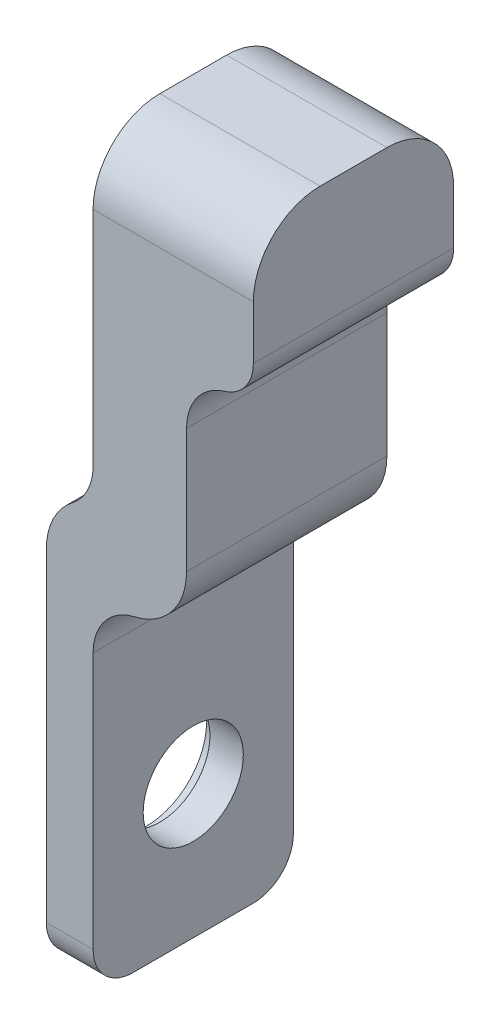
ISO-10303-21;
HEADER;
FILE_DESCRIPTION(('STEP AP214'),'2;1');
FILE_NAME('part.step','',(''),(''),'','','');
FILE_SCHEMA(('AUTOMOTIVE_DESIGN { 1 0 10303 214 1 1 1 1 }'));
ENDSEC;
DATA;
#1=APPLICATION_CONTEXT('core data for automotive mechanical design processes');
#2=APPLICATION_PROTOCOL_DEFINITION('international standard','automotive_design',2000,#1);
#3=PRODUCT_CONTEXT('',#1,'mechanical');
#4=PRODUCT('Part','Part','',(#3));
#5=PRODUCT_RELATED_PRODUCT_CATEGORY('part','',(#4));
#6=PRODUCT_DEFINITION_FORMATION('','',#4);
#7=PRODUCT_DEFINITION_CONTEXT('part definition',#1,'design');
#8=PRODUCT_DEFINITION('design','',#6,#7);
#9=PRODUCT_DEFINITION_SHAPE('','',#8);
#10=(LENGTH_UNIT() NAMED_UNIT(*) SI_UNIT(.MILLI.,.METRE.));
#11=(NAMED_UNIT(*) PLANE_ANGLE_UNIT() SI_UNIT($,.RADIAN.));
#12=(NAMED_UNIT(*) SI_UNIT($,.STERADIAN.) SOLID_ANGLE_UNIT());
#13=UNCERTAINTY_MEASURE_WITH_UNIT(LENGTH_MEASURE(1.E-05),#10,'distance_accuracy_value','');
#14=(GEOMETRIC_REPRESENTATION_CONTEXT(3) GLOBAL_UNCERTAINTY_ASSIGNED_CONTEXT((#13)) GLOBAL_UNIT_ASSIGNED_CONTEXT((#10,
#11,#12)) REPRESENTATION_CONTEXT('',''));
#15=CARTESIAN_POINT('',(0.,0.,0.));
#16=DIRECTION('',(0.,0.,1.));
#17=DIRECTION('',(1.,0.,0.));
#18=AXIS2_PLACEMENT_3D('',#15,#16,#17);
#19=CARTESIAN_POINT('',(-3.50000000000001,0.,-2.5));
#20=DIRECTION('',(-1.,0.,0.));
#21=DIRECTION('',(0.,-1.,0.));
#22=AXIS2_PLACEMENT_3D('',#19,#20,#21);
#23=PLANE('',#22);
#24=CARTESIAN_POINT('',(-3.5,-54.,5.));
#25=DIRECTION('',(1.,0.,0.));
#26=DIRECTION('',(0.,0.,-1.));
#27=AXIS2_PLACEMENT_3D('',#24,#25,#26);
#28=CIRCLE('',#27,4.5);
#29=CARTESIAN_POINT('',(-3.5,-54.,0.499999999999995));
#30=VERTEX_POINT('',#29);
#31=EDGE_CURVE('E247',#30,#30,#28,.T.);
#32=ORIENTED_EDGE('',*,*,#31,.T.);
#33=EDGE_LOOP('',(#32));
#34=FACE_BOUND('',#33,.T.);
#35=DIRECTION('',(0.,-1.,0.));
#36=VECTOR('',#35,1.);
#37=CARTESIAN_POINT('',(-3.50000000000001,0.,-2.5));
#38=LINE('',#37,#36);
#39=CARTESIAN_POINT('',(-3.5,-36.7696960070847,-2.5));
#40=VERTEX_POINT('',#39);
#41=CARTESIAN_POINT('',(-3.5,-61.,-2.5));
#42=VERTEX_POINT('',#41);
#43=EDGE_CURVE('E274',#40,#42,#38,.T.);
#44=ORIENTED_EDGE('',*,*,#43,.T.);
#45=CARTESIAN_POINT('',(-3.5,-61.,0.5));
#46=DIRECTION('',(-1.,0.,0.));
#47=DIRECTION('',(0.,-1.,0.));
#48=AXIS2_PLACEMENT_3D('',#45,#46,#47);
#49=CIRCLE('',#48,3.);
#50=CARTESIAN_POINT('',(-3.5,-64.,0.5));
#51=VERTEX_POINT('',#50);
#52=EDGE_CURVE('E358',#42,#51,#49,.T.);
#53=ORIENTED_EDGE('',*,*,#52,.T.);
#54=DIRECTION('',(0.,0.,1.));
#55=VECTOR('',#54,1.);
#56=CARTESIAN_POINT('',(-3.5,-64.,-2.5));
#57=LINE('',#56,#55);
#58=CARTESIAN_POINT('',(-3.5,-64.,9.5));
#59=VERTEX_POINT('',#58);
#60=EDGE_CURVE('E287',#51,#59,#57,.T.);
#61=ORIENTED_EDGE('',*,*,#60,.T.);
#62=CARTESIAN_POINT('',(-3.5,-61.,9.5));
#63=DIRECTION('',(-1.,0.,0.));
#64=DIRECTION('',(0.,-1.,0.));
#65=AXIS2_PLACEMENT_3D('',#62,#63,#64);
#66=CIRCLE('',#65,3.);
#67=CARTESIAN_POINT('',(-3.5,-61.,12.5));
#68=VERTEX_POINT('',#67);
#69=EDGE_CURVE('E356',#59,#68,#66,.T.);
#70=ORIENTED_EDGE('',*,*,#69,.T.);
#71=DIRECTION('',(0.,-1.,0.));
#72=VECTOR('',#71,1.);
#73=CARTESIAN_POINT('',(-3.50000000000001,0.,12.5));
#74=LINE('',#73,#72);
#75=CARTESIAN_POINT('',(-3.5,-36.7696960070847,12.5));
#76=VERTEX_POINT('',#75);
#77=EDGE_CURVE('E261',#76,#68,#74,.T.);
#78=ORIENTED_EDGE('',*,*,#77,.F.);
#79=DIRECTION('',(0.,0.,-1.));
#80=VECTOR('',#79,1.);
#81=CARTESIAN_POINT('',(-3.5,-36.7696960070847,-2.5));
#82=LINE('',#81,#80);
#83=EDGE_CURVE('E324',#76,#40,#82,.T.);
#84=ORIENTED_EDGE('',*,*,#83,.T.);
#85=EDGE_LOOP('',(#44,#53,#61,#70,#78,#84));
#86=FACE_BOUND('',#85,.T.);
#87=DIRECTION('',(0.,1.,0.));
#88=VECTOR('',#87,1.);
#89=CARTESIAN_POINT('',(-3.50000000000001,0.,6.5));
#90=LINE('',#89,#88);
#91=CARTESIAN_POINT('',(-3.5,-46.75,6.5));
#92=VERTEX_POINT('',#91);
#93=CARTESIAN_POINT('',(-3.5,-45.887509630206,6.5));
#94=VERTEX_POINT('',#93);
#95=EDGE_CURVE('E225',#92,#94,#90,.T.);
#96=ORIENTED_EDGE('',*,*,#95,.F.);
#97=DIRECTION('',(0.,0.,-1.));
#98=VECTOR('',#97,1.);
#99=CARTESIAN_POINT('',(-3.5,-46.75,0.));
#100=LINE('',#99,#98);
#101=CARTESIAN_POINT('',(-3.5,-46.75,3.5));
#102=VERTEX_POINT('',#101);
#103=EDGE_CURVE('E202',#92,#102,#100,.T.);
#104=ORIENTED_EDGE('',*,*,#103,.T.);
#105=DIRECTION('',(0.,1.,0.));
#106=VECTOR('',#105,1.);
#107=CARTESIAN_POINT('',(-3.50000000000001,0.,3.5));
#108=LINE('',#107,#106);
#109=CARTESIAN_POINT('',(-3.5,-45.887509630206,3.5));
#110=VERTEX_POINT('',#109);
#111=EDGE_CURVE('E215',#102,#110,#108,.T.);
#112=ORIENTED_EDGE('',*,*,#111,.T.);
#113=CARTESIAN_POINT('',(-3.5,-54.,5.));
#114=DIRECTION('',(-1.,0.,0.));
#115=DIRECTION('',(0.,-1.,0.));
#116=AXIS2_PLACEMENT_3D('',#113,#114,#115);
#117=CIRCLE('',#116,8.25);
#118=EDGE_CURVE('E227',#94,#110,#117,.T.);
#119=ORIENTED_EDGE('',*,*,#118,.F.);
#120=EDGE_LOOP('',(#96,#104,#112,#119));
#121=FACE_BOUND('',#120,.T.);
#122=ADVANCED_FACE('F53',(#34,#86,#121),#23,.T.);
#123=CARTESIAN_POINT('',(12.,0.,-2.5));
#124=DIRECTION('',(-1.,0.,0.));
#125=DIRECTION('',(0.,-1.,0.));
#126=AXIS2_PLACEMENT_3D('',#123,#124,#125);
#127=PLANE('',#126);
#128=DIRECTION('',(0.,-1.,0.));
#129=VECTOR('',#128,1.);
#130=CARTESIAN_POINT('',(12.,0.,12.5));
#131=LINE('',#130,#129);
#132=CARTESIAN_POINT('',(12.,-13.,12.5));
#133=VERTEX_POINT('',#132);
#134=CARTESIAN_POINT('',(12.,-17.,12.5));
#135=VERTEX_POINT('',#134);
#136=EDGE_CURVE('E255',#133,#135,#131,.T.);
#137=ORIENTED_EDGE('',*,*,#136,.T.);
#138=DIRECTION('',(0.,0.,1.));
#139=VECTOR('',#138,1.);
#140=CARTESIAN_POINT('',(12.,-17.,-2.5));
#141=LINE('',#140,#139);
#142=CARTESIAN_POINT('',(12.,-17.,-2.5));
#143=VERTEX_POINT('',#142);
#144=EDGE_CURVE('E365',#135,#143,#141,.F.);
#145=ORIENTED_EDGE('',*,*,#144,.T.);
#146=DIRECTION('',(0.,-1.,0.));
#147=VECTOR('',#146,1.);
#148=CARTESIAN_POINT('',(12.,0.,-2.5));
#149=LINE('',#148,#147);
#150=CARTESIAN_POINT('',(12.,-13.,-2.5));
#151=VERTEX_POINT('',#150);
#152=EDGE_CURVE('E268',#151,#143,#149,.T.);
#153=ORIENTED_EDGE('',*,*,#152,.F.);
#154=CARTESIAN_POINT('',(12.,-13.,2.5));
#155=DIRECTION('',(-1.,0.,0.));
#156=DIRECTION('',(0.,-1.,0.));
#157=AXIS2_PLACEMENT_3D('',#154,#155,#156);
#158=CIRCLE('',#157,5.);
#159=CARTESIAN_POINT('',(12.,-8.,2.5));
#160=VERTEX_POINT('',#159);
#161=EDGE_CURVE('E313',#151,#160,#158,.F.);
#162=ORIENTED_EDGE('',*,*,#161,.T.);
#163=DIRECTION('',(0.,0.,1.));
#164=VECTOR('',#163,1.);
#165=CARTESIAN_POINT('',(12.,-8.,-2.5));
#166=LINE('',#165,#164);
#167=CARTESIAN_POINT('',(12.,-8.,7.5));
#168=VERTEX_POINT('',#167);
#169=EDGE_CURVE('E282',#160,#168,#166,.T.);
#170=ORIENTED_EDGE('',*,*,#169,.T.);
#171=CARTESIAN_POINT('',(12.,-13.,7.5));
#172=DIRECTION('',(-1.,0.,0.));
#173=DIRECTION('',(0.,-1.,0.));
#174=AXIS2_PLACEMENT_3D('',#171,#172,#173);
#175=CIRCLE('',#174,5.);
#176=EDGE_CURVE('E311',#168,#133,#175,.F.);
#177=ORIENTED_EDGE('',*,*,#176,.T.);
#178=EDGE_LOOP('',(#137,#145,#153,#162,#170,#177));
#179=FACE_BOUND('',#178,.T.);
#180=ADVANCED_FACE('F402',(#179),#127,.F.);
#181=CARTESIAN_POINT('',(7.,0.,-2.5));
#182=DIRECTION('',(1.,0.,0.));
#183=DIRECTION('',(0.,0.,-1.));
#184=AXIS2_PLACEMENT_3D('',#181,#182,#183);
#185=PLANE('',#184);
#186=DIRECTION('',(0.,1.,0.));
#187=VECTOR('',#186,1.);
#188=CARTESIAN_POINT('',(7.,0.,-2.5));
#189=LINE('',#188,#187);
#190=CARTESIAN_POINT('',(7.,-33.,-2.5));
#191=VERTEX_POINT('',#190);
#192=CARTESIAN_POINT('',(7.,-23.7082039324994,-2.5));
#193=VERTEX_POINT('',#192);
#194=EDGE_CURVE('E279',#191,#193,#189,.T.);
#195=ORIENTED_EDGE('',*,*,#194,.T.);
#196=DIRECTION('',(0.,0.,-1.));
#197=VECTOR('',#196,1.);
#198=CARTESIAN_POINT('',(7.,-23.7082039324994,12.5));
#199=LINE('',#198,#197);
#200=CARTESIAN_POINT('',(7.,-23.7082039324994,12.5));
#201=VERTEX_POINT('',#200);
#202=EDGE_CURVE('E369',#193,#201,#199,.F.);
#203=ORIENTED_EDGE('',*,*,#202,.T.);
#204=DIRECTION('',(0.,1.,0.));
#205=VECTOR('',#204,1.);
#206=CARTESIAN_POINT('',(7.,0.,12.5));
#207=LINE('',#206,#205);
#208=CARTESIAN_POINT('',(7.,-33.,12.5));
#209=VERTEX_POINT('',#208);
#210=EDGE_CURVE('E266',#209,#201,#207,.T.);
#211=ORIENTED_EDGE('',*,*,#210,.F.);
#212=DIRECTION('',(0.,0.,1.));
#213=VECTOR('',#212,1.);
#214=CARTESIAN_POINT('',(7.,-33.,-2.5));
#215=LINE('',#214,#213);
#216=EDGE_CURVE('E300',#209,#191,#215,.F.);
#217=ORIENTED_EDGE('',*,*,#216,.T.);
#218=EDGE_LOOP('',(#195,#203,#211,#217));
#219=FACE_BOUND('',#218,.T.);
#220=ADVANCED_FACE('F375',(#219),#185,.T.);
#221=CARTESIAN_POINT('',(0.,0.,-2.5));
#222=DIRECTION('',(1.,0.,0.));
#223=DIRECTION('',(0.,0.,-1.));
#224=AXIS2_PLACEMENT_3D('',#221,#222,#223);
#225=PLANE('',#224);
#226=CARTESIAN_POINT('',(0.,-54.,5.));
#227=DIRECTION('',(1.,0.,0.));
#228=DIRECTION('',(0.,0.,-1.));
#229=AXIS2_PLACEMENT_3D('',#226,#227,#228);
#230=CIRCLE('',#229,3.75);
#231=CARTESIAN_POINT('',(0.,-54.,1.25));
#232=VERTEX_POINT('',#231);
#233=EDGE_CURVE('E243',#232,#232,#230,.F.);
#234=ORIENTED_EDGE('',*,*,#233,.T.);
#235=EDGE_LOOP('',(#234));
#236=FACE_BOUND('',#235,.T.);
#237=DIRECTION('',(0.,0.,1.));
#238=VECTOR('',#237,1.);
#239=CARTESIAN_POINT('',(0.,-64.,-2.5));
#240=LINE('',#239,#238);
#241=CARTESIAN_POINT('',(0.,-64.,0.5));
#242=VERTEX_POINT('',#241);
#243=CARTESIAN_POINT('',(0.,-64.,9.5));
#244=VERTEX_POINT('',#243);
#245=EDGE_CURVE('E283',#242,#244,#240,.T.);
#246=ORIENTED_EDGE('',*,*,#245,.F.);
#247=CARTESIAN_POINT('',(0.,-61.,0.5));
#248=DIRECTION('',(1.,0.,0.));
#249=DIRECTION('',(0.,0.,-1.));
#250=AXIS2_PLACEMENT_3D('',#247,#248,#249);
#251=CIRCLE('',#250,3.);
#252=CARTESIAN_POINT('',(0.,-61.,-2.5));
#253=VERTEX_POINT('',#252);
#254=EDGE_CURVE('E352',#242,#253,#251,.T.);
#255=ORIENTED_EDGE('',*,*,#254,.T.);
#256=DIRECTION('',(0.,1.,0.));
#257=VECTOR('',#256,1.);
#258=CARTESIAN_POINT('',(0.,0.,-2.5));
#259=LINE('',#258,#257);
#260=CARTESIAN_POINT('',(0.,-41.7749643873921,-2.5));
#261=VERTEX_POINT('',#260);
#262=EDGE_CURVE('E277',#253,#261,#259,.T.);
#263=ORIENTED_EDGE('',*,*,#262,.T.);
#264=DIRECTION('',(0.,0.,-1.));
#265=VECTOR('',#264,1.);
#266=CARTESIAN_POINT('',(0.,-41.7749643873921,12.5));
#267=LINE('',#266,#265);
#268=CARTESIAN_POINT('',(0.,-41.7749643873921,12.5));
#269=VERTEX_POINT('',#268);
#270=EDGE_CURVE('E335',#261,#269,#267,.F.);
#271=ORIENTED_EDGE('',*,*,#270,.T.);
#272=DIRECTION('',(0.,1.,0.));
#273=VECTOR('',#272,1.);
#274=CARTESIAN_POINT('',(0.,0.,12.5));
#275=LINE('',#274,#273);
#276=CARTESIAN_POINT('',(0.,-61.,12.5));
#277=VERTEX_POINT('',#276);
#278=EDGE_CURVE('E264',#277,#269,#275,.T.);
#279=ORIENTED_EDGE('',*,*,#278,.F.);
#280=CARTESIAN_POINT('',(0.,-61.,9.5));
#281=DIRECTION('',(1.,0.,0.));
#282=DIRECTION('',(0.,0.,-1.));
#283=AXIS2_PLACEMENT_3D('',#280,#281,#282);
#284=CIRCLE('',#283,3.);
#285=EDGE_CURVE('E350',#277,#244,#284,.T.);
#286=ORIENTED_EDGE('',*,*,#285,.T.);
#287=EDGE_LOOP('',(#246,#255,#263,#271,#279,#286));
#288=FACE_BOUND('',#287,.T.);
#289=ADVANCED_FACE('F484',(#236,#288),#225,.T.);
#290=CARTESIAN_POINT('',(0.,-64.,-2.5));
#291=DIRECTION('',(0.,-1.,0.));
#292=DIRECTION('',(0.,0.,-1.));
#293=AXIS2_PLACEMENT_3D('',#290,#291,#292);
#294=PLANE('',#293);
#295=ORIENTED_EDGE('',*,*,#60,.F.);
#296=DIRECTION('',(1.,0.,0.));
#297=VECTOR('',#296,1.);
#298=CARTESIAN_POINT('',(0.,-64.,0.5));
#299=LINE('',#298,#297);
#300=EDGE_CURVE('E347',#51,#242,#299,.T.);
#301=ORIENTED_EDGE('',*,*,#300,.T.);
#302=ORIENTED_EDGE('',*,*,#245,.T.);
#303=DIRECTION('',(1.,0.,0.));
#304=VECTOR('',#303,1.);
#305=CARTESIAN_POINT('',(0.,-64.,9.5));
#306=LINE('',#305,#304);
#307=EDGE_CURVE('E345',#244,#59,#306,.F.);
#308=ORIENTED_EDGE('',*,*,#307,.T.);
#309=EDGE_LOOP('',(#295,#301,#302,#308));
#310=FACE_BOUND('',#309,.T.);
#311=ADVANCED_FACE('F413',(#310),#294,.T.);
#312=CARTESIAN_POINT('',(0.,0.,-2.5));
#313=DIRECTION('',(-1.,0.,0.));
#314=DIRECTION('',(0.,-1.,0.));
#315=AXIS2_PLACEMENT_3D('',#312,#313,#314);
#316=PLANE('',#315);
#317=CARTESIAN_POINT('',(0.,-16.5,5.));
#318=DIRECTION('',(1.,0.,0.));
#319=DIRECTION('',(0.,0.,-1.));
#320=AXIS2_PLACEMENT_3D('',#317,#318,#319);
#321=CIRCLE('',#320,3.25);
#322=CARTESIAN_POINT('',(0.,-16.5,1.75));
#323=VERTEX_POINT('',#322);
#324=EDGE_CURVE('E234',#323,#323,#321,.T.);
#325=ORIENTED_EDGE('',*,*,#324,.T.);
#326=EDGE_LOOP('',(#325));
#327=FACE_BOUND('',#326,.T.);
#328=DIRECTION('',(0.,-1.,0.));
#329=VECTOR('',#328,1.);
#330=CARTESIAN_POINT('',(0.,0.,-2.5));
#331=LINE('',#330,#329);
#332=CARTESIAN_POINT('',(0.,-13.,-2.5));
#333=VERTEX_POINT('',#332);
#334=CARTESIAN_POINT('',(0.,-29.6457925826972,-2.5));
#335=VERTEX_POINT('',#334);
#336=EDGE_CURVE('E271',#333,#335,#331,.T.);
#337=ORIENTED_EDGE('',*,*,#336,.T.);
#338=DIRECTION('',(0.,0.,-1.));
#339=VECTOR('',#338,1.);
#340=CARTESIAN_POINT('',(0.,-29.6457925826972,12.5));
#341=LINE('',#340,#339);
#342=CARTESIAN_POINT('',(0.,-29.6457925826972,12.5));
#343=VERTEX_POINT('',#342);
#344=EDGE_CURVE('E326',#335,#343,#341,.F.);
#345=ORIENTED_EDGE('',*,*,#344,.T.);
#346=DIRECTION('',(0.,-1.,0.));
#347=VECTOR('',#346,1.);
#348=CARTESIAN_POINT('',(0.,0.,12.5));
#349=LINE('',#348,#347);
#350=CARTESIAN_POINT('',(0.,-13.,12.5));
#351=VERTEX_POINT('',#350);
#352=EDGE_CURVE('E258',#351,#343,#349,.T.);
#353=ORIENTED_EDGE('',*,*,#352,.F.);
#354=CARTESIAN_POINT('',(0.,-13.,7.5));
#355=DIRECTION('',(-1.,0.,0.));
#356=DIRECTION('',(0.,-1.,0.));
#357=AXIS2_PLACEMENT_3D('',#354,#355,#356);
#358=CIRCLE('',#357,5.);
#359=CARTESIAN_POINT('',(0.,-8.,7.5));
#360=VERTEX_POINT('',#359);
#361=EDGE_CURVE('E320',#351,#360,#358,.T.);
#362=ORIENTED_EDGE('',*,*,#361,.T.);
#363=DIRECTION('',(0.,0.,1.));
#364=VECTOR('',#363,1.);
#365=CARTESIAN_POINT('',(0.,-8.,-2.5));
#366=LINE('',#365,#364);
#367=CARTESIAN_POINT('',(0.,-8.,2.5));
#368=VERTEX_POINT('',#367);
#369=EDGE_CURVE('E290',#368,#360,#366,.T.);
#370=ORIENTED_EDGE('',*,*,#369,.F.);
#371=CARTESIAN_POINT('',(0.,-13.,2.5));
#372=DIRECTION('',(-1.,0.,0.));
#373=DIRECTION('',(0.,-1.,0.));
#374=AXIS2_PLACEMENT_3D('',#371,#372,#373);
#375=CIRCLE('',#374,5.);
#376=EDGE_CURVE('E322',#368,#333,#375,.T.);
#377=ORIENTED_EDGE('',*,*,#376,.T.);
#378=EDGE_LOOP('',(#337,#345,#353,#362,#370,#377));
#379=FACE_BOUND('',#378,.T.);
#380=ADVANCED_FACE('F415',(#327,#379),#316,.T.);
#381=CARTESIAN_POINT('',(0.,-8.,-2.5));
#382=DIRECTION('',(0.,-1.,0.));
#383=DIRECTION('',(0.,0.,-1.));
#384=AXIS2_PLACEMENT_3D('',#381,#382,#383);
#385=PLANE('',#384);
#386=ORIENTED_EDGE('',*,*,#169,.F.);
#387=DIRECTION('',(1.,0.,0.));
#388=VECTOR('',#387,1.);
#389=CARTESIAN_POINT('',(0.,-8.,2.5));
#390=LINE('',#389,#388);
#391=EDGE_CURVE('E318',#160,#368,#390,.F.);
#392=ORIENTED_EDGE('',*,*,#391,.T.);
#393=ORIENTED_EDGE('',*,*,#369,.T.);
#394=DIRECTION('',(1.,0.,0.));
#395=VECTOR('',#394,1.);
#396=CARTESIAN_POINT('',(12.,-8.,7.5));
#397=LINE('',#396,#395);
#398=EDGE_CURVE('E315',#360,#168,#397,.T.);
#399=ORIENTED_EDGE('',*,*,#398,.T.);
#400=EDGE_LOOP('',(#386,#392,#393,#399));
#401=FACE_BOUND('',#400,.T.);
#402=ADVANCED_FACE('F418',(#401),#385,.F.);
#403=CARTESIAN_POINT('',(0.,0.,-2.5));
#404=DIRECTION('',(0.,0.,1.));
#405=DIRECTION('',(1.,0.,0.));
#406=AXIS2_PLACEMENT_3D('',#403,#404,#405);
#407=PLANE('',#406);
#408=ORIENTED_EDGE('',*,*,#152,.T.);
#409=CARTESIAN_POINT('',(8.99999999999999,-17.,-2.5));
#410=DIRECTION('',(0.,0.,1.));
#411=DIRECTION('',(1.,0.,0.));
#412=AXIS2_PLACEMENT_3D('',#409,#410,#411);
#413=CIRCLE('',#412,3.);
#414=CARTESIAN_POINT('',(9.85714285714285,-19.8749445424997,-2.5));
#415=VERTEX_POINT('',#414);
#416=EDGE_CURVE('E367',#143,#415,#413,.F.);
#417=ORIENTED_EDGE('',*,*,#416,.T.);
#418=CARTESIAN_POINT('',(11.,-23.7082039324994,-2.5));
#419=DIRECTION('',(0.,0.,1.));
#420=DIRECTION('',(1.,0.,0.));
#421=AXIS2_PLACEMENT_3D('',#418,#419,#420);
#422=CIRCLE('',#421,4.);
#423=EDGE_CURVE('E12',#415,#193,#422,.T.);
#424=ORIENTED_EDGE('',*,*,#423,.T.);
#425=ORIENTED_EDGE('',*,*,#194,.F.);
#426=CARTESIAN_POINT('',(2.,-33.,-2.5));
#427=DIRECTION('',(0.,0.,1.));
#428=DIRECTION('',(1.,0.,0.));
#429=AXIS2_PLACEMENT_3D('',#426,#427,#428);
#430=CIRCLE('',#429,5.);
#431=CARTESIAN_POINT('',(3.11111111111111,-37.8749802152178,-2.5));
#432=VERTEX_POINT('',#431);
#433=EDGE_CURVE('E308',#191,#432,#430,.F.);
#434=ORIENTED_EDGE('',*,*,#433,.T.);
#435=CARTESIAN_POINT('',(4.,-41.7749643873921,-2.5));
#436=DIRECTION('',(0.,0.,1.));
#437=DIRECTION('',(1.,0.,0.));
#438=AXIS2_PLACEMENT_3D('',#435,#436,#437);
#439=CIRCLE('',#438,4.);
#440=EDGE_CURVE('E342',#432,#261,#439,.T.);
#441=ORIENTED_EDGE('',*,*,#440,.T.);
#442=ORIENTED_EDGE('',*,*,#262,.F.);
#443=DIRECTION('',(1.,0.,0.));
#444=VECTOR('',#443,1.);
#445=CARTESIAN_POINT('',(-3.5,-61.,-2.5));
#446=LINE('',#445,#444);
#447=EDGE_CURVE('E354',#253,#42,#446,.F.);
#448=ORIENTED_EDGE('',*,*,#447,.T.);
#449=ORIENTED_EDGE('',*,*,#43,.F.);
#450=CARTESIAN_POINT('',(1.5,-36.7696960070847,-2.5));
#451=DIRECTION('',(0.,0.,1.));
#452=DIRECTION('',(1.,0.,0.));
#453=AXIS2_PLACEMENT_3D('',#450,#451,#452);
#454=CIRCLE('',#453,5.);
#455=CARTESIAN_POINT('',(-1.55555555555553,-32.811971882425,-2.5));
#456=VERTEX_POINT('',#455);
#457=EDGE_CURVE('E302',#40,#456,#454,.F.);
#458=ORIENTED_EDGE('',*,*,#457,.T.);
#459=CARTESIAN_POINT('',(-3.99999999999996,-29.6457925826972,-2.5));
#460=DIRECTION('',(0.,0.,1.));
#461=DIRECTION('',(1.,0.,0.));
#462=AXIS2_PLACEMENT_3D('',#459,#460,#461);
#463=CIRCLE('',#462,4.);
#464=EDGE_CURVE('E333',#456,#335,#463,.T.);
#465=ORIENTED_EDGE('',*,*,#464,.T.);
#466=ORIENTED_EDGE('',*,*,#336,.F.);
#467=DIRECTION('',(1.,0.,0.));
#468=VECTOR('',#467,1.);
#469=CARTESIAN_POINT('',(0.,-13.,-2.5));
#470=LINE('',#469,#468);
#471=EDGE_CURVE('E305',#333,#151,#470,.T.);
#472=ORIENTED_EDGE('',*,*,#471,.T.);
#473=EDGE_LOOP('',(#408,#417,#424,#425,#434,#441,#442,#448,#449,#458,#465,#466,#472));
#474=FACE_BOUND('',#473,.T.);
#475=ADVANCED_FACE('F393',(#474),#407,.F.);
#476=CARTESIAN_POINT('',(0.,0.,12.5));
#477=DIRECTION('',(0.,0.,1.));
#478=DIRECTION('',(1.,0.,0.));
#479=AXIS2_PLACEMENT_3D('',#476,#477,#478);
#480=PLANE('',#479);
#481=ORIENTED_EDGE('',*,*,#210,.T.);
#482=CARTESIAN_POINT('',(11.,-23.7082039324994,12.5));
#483=DIRECTION('',(0.,0.,1.));
#484=DIRECTION('',(1.,0.,0.));
#485=AXIS2_PLACEMENT_3D('',#482,#483,#484);
#486=CIRCLE('',#485,4.);
#487=CARTESIAN_POINT('',(9.85714285714285,-19.8749445424997,12.5));
#488=VERTEX_POINT('',#487);
#489=EDGE_CURVE('E61',#201,#488,#486,.F.);
#490=ORIENTED_EDGE('',*,*,#489,.T.);
#491=CARTESIAN_POINT('',(8.99999999999999,-17.,12.5));
#492=DIRECTION('',(0.,0.,1.));
#493=DIRECTION('',(1.,0.,0.));
#494=AXIS2_PLACEMENT_3D('',#491,#492,#493);
#495=CIRCLE('',#494,3.);
#496=EDGE_CURVE('E363',#488,#135,#495,.T.);
#497=ORIENTED_EDGE('',*,*,#496,.T.);
#498=ORIENTED_EDGE('',*,*,#136,.F.);
#499=DIRECTION('',(1.,0.,0.));
#500=VECTOR('',#499,1.);
#501=CARTESIAN_POINT('',(0.,-13.,12.5));
#502=LINE('',#501,#500);
#503=EDGE_CURVE('E296',#133,#351,#502,.F.);
#504=ORIENTED_EDGE('',*,*,#503,.T.);
#505=ORIENTED_EDGE('',*,*,#352,.T.);
#506=CARTESIAN_POINT('',(-3.99999999999996,-29.6457925826972,12.5));
#507=DIRECTION('',(0.,0.,1.));
#508=DIRECTION('',(1.,0.,0.));
#509=AXIS2_PLACEMENT_3D('',#506,#507,#508);
#510=CIRCLE('',#509,4.);
#511=CARTESIAN_POINT('',(-1.55555555555553,-32.811971882425,12.5));
#512=VERTEX_POINT('',#511);
#513=EDGE_CURVE('E331',#343,#512,#510,.F.);
#514=ORIENTED_EDGE('',*,*,#513,.T.);
#515=CARTESIAN_POINT('',(1.5,-36.7696960070847,12.5));
#516=DIRECTION('',(0.,0.,1.));
#517=DIRECTION('',(1.,0.,0.));
#518=AXIS2_PLACEMENT_3D('',#515,#516,#517);
#519=CIRCLE('',#518,5.);
#520=EDGE_CURVE('E286',#512,#76,#519,.T.);
#521=ORIENTED_EDGE('',*,*,#520,.T.);
#522=ORIENTED_EDGE('',*,*,#77,.T.);
#523=DIRECTION('',(1.,0.,0.));
#524=VECTOR('',#523,1.);
#525=CARTESIAN_POINT('',(0.,-61.,12.5));
#526=LINE('',#525,#524);
#527=EDGE_CURVE('E360',#68,#277,#526,.T.);
#528=ORIENTED_EDGE('',*,*,#527,.T.);
#529=ORIENTED_EDGE('',*,*,#278,.T.);
#530=CARTESIAN_POINT('',(4.,-41.7749643873921,12.5));
#531=DIRECTION('',(0.,0.,1.));
#532=DIRECTION('',(1.,0.,0.));
#533=AXIS2_PLACEMENT_3D('',#530,#531,#532);
#534=CIRCLE('',#533,4.);
#535=CARTESIAN_POINT('',(3.11111111111111,-37.8749802152178,12.5));
#536=VERTEX_POINT('',#535);
#537=EDGE_CURVE('E340',#269,#536,#534,.F.);
#538=ORIENTED_EDGE('',*,*,#537,.T.);
#539=CARTESIAN_POINT('',(2.,-33.,12.5));
#540=DIRECTION('',(0.,0.,1.));
#541=DIRECTION('',(1.,0.,0.));
#542=AXIS2_PLACEMENT_3D('',#539,#540,#541);
#543=CIRCLE('',#542,5.);
#544=EDGE_CURVE('E298',#536,#209,#543,.T.);
#545=ORIENTED_EDGE('',*,*,#544,.T.);
#546=EDGE_LOOP('',(#481,#490,#497,#498,#504,#505,#514,#521,#522,#528,#529,#538,#545));
#547=FACE_BOUND('',#546,.T.);
#548=ADVANCED_FACE('F380',(#547),#480,.T.);
#549=CARTESIAN_POINT('',(-2.5,0.,0.));
#550=DIRECTION('',(1.,0.,0.));
#551=DIRECTION('',(0.,0.,-1.));
#552=AXIS2_PLACEMENT_3D('',#549,#550,#551);
#553=PLANE('',#552);
#554=CARTESIAN_POINT('',(-2.5,-54.,5.));
#555=DIRECTION('',(-1.,0.,0.));
#556=DIRECTION('',(0.,0.,1.));
#557=AXIS2_PLACEMENT_3D('',#554,#555,#556);
#558=CIRCLE('',#557,3.75);
#559=CARTESIAN_POINT('',(-2.5,-54.,8.75));
#560=VERTEX_POINT('',#559);
#561=EDGE_CURVE('E244',#560,#560,#558,.T.);
#562=ORIENTED_EDGE('',*,*,#561,.F.);
#563=EDGE_LOOP('',(#562));
#564=FACE_BOUND('',#563,.T.);
#565=CARTESIAN_POINT('',(-2.5,-54.,5.));
#566=DIRECTION('',(1.,0.,0.));
#567=DIRECTION('',(0.,0.,-1.));
#568=AXIS2_PLACEMENT_3D('',#565,#566,#567);
#569=CIRCLE('',#568,4.5);
#570=CARTESIAN_POINT('',(-2.5,-54.,0.499999999999995));
#571=VERTEX_POINT('',#570);
#572=EDGE_CURVE('E252',#571,#571,#569,.T.);
#573=ORIENTED_EDGE('',*,*,#572,.F.);
#574=EDGE_LOOP('',(#573));
#575=FACE_BOUND('',#574,.T.);
#576=ADVANCED_FACE('F497',(#564,#575),#553,.F.);
#577=CARTESIAN_POINT('',(-3.5,-54.,5.));
#578=DIRECTION('',(1.,0.,0.));
#579=DIRECTION('',(0.,0.,-1.));
#580=AXIS2_PLACEMENT_3D('',#577,#578,#579);
#581=CYLINDRICAL_SURFACE('',#580,4.5);
#582=ORIENTED_EDGE('',*,*,#31,.F.);
#583=EDGE_LOOP('',(#582));
#584=FACE_BOUND('',#583,.T.);
#585=ORIENTED_EDGE('',*,*,#572,.T.);
#586=EDGE_LOOP('',(#585));
#587=FACE_BOUND('',#586,.T.);
#588=ADVANCED_FACE('F498',(#584,#587),#581,.F.);
#589=CARTESIAN_POINT('',(12.001,-54.,5.));
#590=DIRECTION('',(-1.,0.,0.));
#591=DIRECTION('',(0.,0.,1.));
#592=AXIS2_PLACEMENT_3D('',#589,#590,#591);
#593=CYLINDRICAL_SURFACE('',#592,3.75);
#594=ORIENTED_EDGE('',*,*,#233,.F.);
#595=EDGE_LOOP('',(#594));
#596=FACE_BOUND('',#595,.T.);
#597=ORIENTED_EDGE('',*,*,#561,.T.);
#598=EDGE_LOOP('',(#597));
#599=FACE_BOUND('',#598,.T.);
#600=ADVANCED_FACE('F502',(#596,#599),#593,.F.);
#601=CARTESIAN_POINT('',(10.,0.,0.));
#602=DIRECTION('',(1.,0.,0.));
#603=DIRECTION('',(0.,0.,-1.));
#604=AXIS2_PLACEMENT_3D('',#601,#602,#603);
#605=PLANE('',#604);
#606=CARTESIAN_POINT('',(10.,-16.5,5.));
#607=DIRECTION('',(1.,0.,0.));
#608=DIRECTION('',(0.,0.,-1.));
#609=AXIS2_PLACEMENT_3D('',#606,#607,#608);
#610=CIRCLE('',#609,3.25);
#611=CARTESIAN_POINT('',(10.,-16.5,1.75));
#612=VERTEX_POINT('',#611);
#613=EDGE_CURVE('E240',#612,#612,#610,.T.);
#614=ORIENTED_EDGE('',*,*,#613,.F.);
#615=EDGE_LOOP('',(#614));
#616=FACE_BOUND('',#615,.T.);
#617=ADVANCED_FACE('F508',(#616),#605,.F.);
#618=CARTESIAN_POINT('',(0.,-16.5,5.));
#619=DIRECTION('',(1.,0.,0.));
#620=DIRECTION('',(0.,0.,-1.));
#621=AXIS2_PLACEMENT_3D('',#618,#619,#620);
#622=CYLINDRICAL_SURFACE('',#621,3.25);
#623=ORIENTED_EDGE('',*,*,#324,.F.);
#624=EDGE_LOOP('',(#623));
#625=FACE_BOUND('',#624,.T.);
#626=ORIENTED_EDGE('',*,*,#613,.T.);
#627=EDGE_LOOP('',(#626));
#628=FACE_BOUND('',#627,.T.);
#629=ADVANCED_FACE('F510',(#625,#628),#622,.F.);
#630=CARTESIAN_POINT('',(-1.,-46.75,0.));
#631=DIRECTION('',(0.,1.,0.));
#632=DIRECTION('',(-1.,0.,0.));
#633=AXIS2_PLACEMENT_3D('',#630,#631,#632);
#634=PLANE('',#633);
#635=ORIENTED_EDGE('',*,*,#103,.F.);
#636=DIRECTION('',(-1.,0.,0.));
#637=VECTOR('',#636,1.);
#638=CARTESIAN_POINT('',(-1.,-46.75,6.5));
#639=LINE('',#638,#637);
#640=CARTESIAN_POINT('',(-1.,-46.75,6.5));
#641=VERTEX_POINT('',#640);
#642=EDGE_CURVE('E195',#641,#92,#639,.T.);
#643=ORIENTED_EDGE('',*,*,#642,.F.);
#644=DIRECTION('',(0.,0.,-1.));
#645=VECTOR('',#644,1.);
#646=CARTESIAN_POINT('',(-1.,-46.75,0.));
#647=LINE('',#646,#645);
#648=CARTESIAN_POINT('',(-1.,-46.75,3.5));
#649=VERTEX_POINT('',#648);
#650=EDGE_CURVE('E199',#641,#649,#647,.T.);
#651=ORIENTED_EDGE('',*,*,#650,.T.);
#652=DIRECTION('',(-1.,0.,0.));
#653=VECTOR('',#652,1.);
#654=CARTESIAN_POINT('',(-1.,-46.75,3.5));
#655=LINE('',#654,#653);
#656=EDGE_CURVE('E232',#649,#102,#655,.T.);
#657=ORIENTED_EDGE('',*,*,#656,.T.);
#658=EDGE_LOOP('',(#635,#643,#651,#657));
#659=FACE_BOUND('',#658,.T.);
#660=ADVANCED_FACE('F197',(#659),#634,.T.);
#661=CARTESIAN_POINT('',(-1.00000000000001,0.,3.5));
#662=DIRECTION('',(0.,0.,1.));
#663=DIRECTION('',(1.,0.,0.));
#664=AXIS2_PLACEMENT_3D('',#661,#662,#663);
#665=PLANE('',#664);
#666=ORIENTED_EDGE('',*,*,#111,.F.);
#667=ORIENTED_EDGE('',*,*,#656,.F.);
#668=DIRECTION('',(0.,1.,0.));
#669=VECTOR('',#668,1.);
#670=CARTESIAN_POINT('',(-1.00000000000001,0.,3.5));
#671=LINE('',#670,#669);
#672=CARTESIAN_POINT('',(-1.,-45.887509630206,3.5));
#673=VERTEX_POINT('',#672);
#674=EDGE_CURVE('E208',#649,#673,#671,.T.);
#675=ORIENTED_EDGE('',*,*,#674,.T.);
#676=DIRECTION('',(-1.,0.,0.));
#677=VECTOR('',#676,1.);
#678=CARTESIAN_POINT('',(-1.,-45.887509630206,3.5));
#679=LINE('',#678,#677);
#680=EDGE_CURVE('E235',#673,#110,#679,.T.);
#681=ORIENTED_EDGE('',*,*,#680,.T.);
#682=EDGE_LOOP('',(#666,#667,#675,#681));
#683=FACE_BOUND('',#682,.T.);
#684=ADVANCED_FACE('F519',(#683),#665,.T.);
#685=CARTESIAN_POINT('',(-1.,-54.,5.));
#686=DIRECTION('',(-1.,0.,0.));
#687=DIRECTION('',(0.,-1.,0.));
#688=AXIS2_PLACEMENT_3D('',#685,#686,#687);
#689=CYLINDRICAL_SURFACE('',#688,8.25);
#690=ORIENTED_EDGE('',*,*,#118,.T.);
#691=ORIENTED_EDGE('',*,*,#680,.F.);
#692=CARTESIAN_POINT('',(-1.,-54.,5.));
#693=DIRECTION('',(-1.,0.,0.));
#694=DIRECTION('',(0.,-1.,0.));
#695=AXIS2_PLACEMENT_3D('',#692,#693,#694);
#696=CIRCLE('',#695,8.25);
#697=CARTESIAN_POINT('',(-1.,-45.887509630206,6.5));
#698=VERTEX_POINT('',#697);
#699=EDGE_CURVE('E219',#698,#673,#696,.T.);
#700=ORIENTED_EDGE('',*,*,#699,.F.);
#701=DIRECTION('',(-1.,0.,0.));
#702=VECTOR('',#701,1.);
#703=CARTESIAN_POINT('',(-1.,-45.887509630206,6.5));
#704=LINE('',#703,#702);
#705=EDGE_CURVE('E207',#698,#94,#704,.T.);
#706=ORIENTED_EDGE('',*,*,#705,.T.);
#707=EDGE_LOOP('',(#690,#691,#700,#706));
#708=FACE_BOUND('',#707,.T.);
#709=ADVANCED_FACE('F522',(#708),#689,.F.);
#710=CARTESIAN_POINT('',(-1.00000000000001,0.,6.5));
#711=DIRECTION('',(0.,0.,1.));
#712=DIRECTION('',(1.,0.,0.));
#713=AXIS2_PLACEMENT_3D('',#710,#711,#712);
#714=PLANE('',#713);
#715=ORIENTED_EDGE('',*,*,#95,.T.);
#716=ORIENTED_EDGE('',*,*,#705,.F.);
#717=DIRECTION('',(0.,1.,0.));
#718=VECTOR('',#717,1.);
#719=CARTESIAN_POINT('',(-1.00000000000001,0.,6.5));
#720=LINE('',#719,#718);
#721=EDGE_CURVE('E214',#641,#698,#720,.T.);
#722=ORIENTED_EDGE('',*,*,#721,.F.);
#723=ORIENTED_EDGE('',*,*,#642,.T.);
#724=EDGE_LOOP('',(#715,#716,#722,#723));
#725=FACE_BOUND('',#724,.T.);
#726=ADVANCED_FACE('F217',(#725),#714,.F.);
#727=CARTESIAN_POINT('',(-1.00000000000001,0.,0.));
#728=DIRECTION('',(-1.,0.,0.));
#729=DIRECTION('',(0.,-1.,0.));
#730=AXIS2_PLACEMENT_3D('',#727,#728,#729);
#731=PLANE('',#730);
#732=ORIENTED_EDGE('',*,*,#650,.F.);
#733=ORIENTED_EDGE('',*,*,#721,.T.);
#734=ORIENTED_EDGE('',*,*,#699,.T.);
#735=ORIENTED_EDGE('',*,*,#674,.F.);
#736=EDGE_LOOP('',(#732,#733,#734,#735));
#737=FACE_BOUND('',#736,.T.);
#738=ADVANCED_FACE('F212',(#737),#731,.T.);
#739=CARTESIAN_POINT('',(2.,-33.,-2.5));
#740=DIRECTION('',(0.,0.,1.));
#741=DIRECTION('',(1.,0.,0.));
#742=AXIS2_PLACEMENT_3D('',#739,#740,#741);
#743=CYLINDRICAL_SURFACE('',#742,5.);
#744=ORIENTED_EDGE('',*,*,#544,.F.);
#745=DIRECTION('',(0.,0.,1.));
#746=VECTOR('',#745,1.);
#747=CARTESIAN_POINT('',(3.11111111111111,-37.8749802152178,-2.5));
#748=LINE('',#747,#746);
#749=EDGE_CURVE('E338',#536,#432,#748,.F.);
#750=ORIENTED_EDGE('',*,*,#749,.T.);
#751=ORIENTED_EDGE('',*,*,#433,.F.);
#752=ORIENTED_EDGE('',*,*,#216,.F.);
#753=EDGE_LOOP('',(#744,#750,#751,#752));
#754=FACE_BOUND('',#753,.T.);
#755=ADVANCED_FACE('F385',(#754),#743,.T.);
#756=CARTESIAN_POINT('',(0.,-13.,2.5));
#757=DIRECTION('',(1.,0.,0.));
#758=DIRECTION('',(0.,0.,-1.));
#759=AXIS2_PLACEMENT_3D('',#756,#757,#758);
#760=CYLINDRICAL_SURFACE('',#759,5.);
#761=ORIENTED_EDGE('',*,*,#376,.F.);
#762=ORIENTED_EDGE('',*,*,#391,.F.);
#763=ORIENTED_EDGE('',*,*,#161,.F.);
#764=ORIENTED_EDGE('',*,*,#471,.F.);
#765=EDGE_LOOP('',(#761,#762,#763,#764));
#766=FACE_BOUND('',#765,.T.);
#767=ADVANCED_FACE('F425',(#766),#760,.T.);
#768=CARTESIAN_POINT('',(0.,-13.,7.5));
#769=DIRECTION('',(-1.,0.,0.));
#770=DIRECTION('',(0.,0.,1.));
#771=AXIS2_PLACEMENT_3D('',#768,#769,#770);
#772=CYLINDRICAL_SURFACE('',#771,5.);
#773=ORIENTED_EDGE('',*,*,#361,.F.);
#774=ORIENTED_EDGE('',*,*,#503,.F.);
#775=ORIENTED_EDGE('',*,*,#176,.F.);
#776=ORIENTED_EDGE('',*,*,#398,.F.);
#777=EDGE_LOOP('',(#773,#774,#775,#776));
#778=FACE_BOUND('',#777,.T.);
#779=ADVANCED_FACE('F428',(#778),#772,.T.);
#780=CARTESIAN_POINT('',(1.5,-36.7696960070847,-2.5));
#781=DIRECTION('',(0.,0.,1.));
#782=DIRECTION('',(1.,0.,0.));
#783=AXIS2_PLACEMENT_3D('',#780,#781,#782);
#784=CYLINDRICAL_SURFACE('',#783,5.);
#785=ORIENTED_EDGE('',*,*,#520,.F.);
#786=DIRECTION('',(0.,0.,1.));
#787=VECTOR('',#786,1.);
#788=CARTESIAN_POINT('',(-1.55555555555553,-32.811971882425,-2.5));
#789=LINE('',#788,#787);
#790=EDGE_CURVE('E329',#512,#456,#789,.F.);
#791=ORIENTED_EDGE('',*,*,#790,.T.);
#792=ORIENTED_EDGE('',*,*,#457,.F.);
#793=ORIENTED_EDGE('',*,*,#83,.F.);
#794=EDGE_LOOP('',(#785,#791,#792,#793));
#795=FACE_BOUND('',#794,.T.);
#796=ADVANCED_FACE('F432',(#795),#784,.T.);
#797=CARTESIAN_POINT('',(-3.99999999999996,-29.6457925826972,-2.5));
#798=DIRECTION('',(0.,0.,1.));
#799=DIRECTION('',(1.,0.,0.));
#800=AXIS2_PLACEMENT_3D('',#797,#798,#799);
#801=CYLINDRICAL_SURFACE('',#800,4.);
#802=ORIENTED_EDGE('',*,*,#464,.F.);
#803=ORIENTED_EDGE('',*,*,#790,.F.);
#804=ORIENTED_EDGE('',*,*,#513,.F.);
#805=ORIENTED_EDGE('',*,*,#344,.F.);
#806=EDGE_LOOP('',(#802,#803,#804,#805));
#807=FACE_BOUND('',#806,.T.);
#808=ADVANCED_FACE('F436',(#807),#801,.F.);
#809=CARTESIAN_POINT('',(4.,-41.7749643873921,-2.5));
#810=DIRECTION('',(0.,0.,1.));
#811=DIRECTION('',(1.,0.,0.));
#812=AXIS2_PLACEMENT_3D('',#809,#810,#811);
#813=CYLINDRICAL_SURFACE('',#812,4.);
#814=ORIENTED_EDGE('',*,*,#440,.F.);
#815=ORIENTED_EDGE('',*,*,#749,.F.);
#816=ORIENTED_EDGE('',*,*,#537,.F.);
#817=ORIENTED_EDGE('',*,*,#270,.F.);
#818=EDGE_LOOP('',(#814,#815,#816,#817));
#819=FACE_BOUND('',#818,.T.);
#820=ADVANCED_FACE('F389',(#819),#813,.F.);
#821=CARTESIAN_POINT('',(0.,-61.,0.5));
#822=DIRECTION('',(-1.,0.,0.));
#823=DIRECTION('',(0.,0.,1.));
#824=AXIS2_PLACEMENT_3D('',#821,#822,#823);
#825=CYLINDRICAL_SURFACE('',#824,3.);
#826=ORIENTED_EDGE('',*,*,#52,.F.);
#827=ORIENTED_EDGE('',*,*,#447,.F.);
#828=ORIENTED_EDGE('',*,*,#254,.F.);
#829=ORIENTED_EDGE('',*,*,#300,.F.);
#830=EDGE_LOOP('',(#826,#827,#828,#829));
#831=FACE_BOUND('',#830,.T.);
#832=ADVANCED_FACE('F443',(#831),#825,.T.);
#833=CARTESIAN_POINT('',(0.,-61.,9.5));
#834=DIRECTION('',(1.,0.,0.));
#835=DIRECTION('',(0.,0.,-1.));
#836=AXIS2_PLACEMENT_3D('',#833,#834,#835);
#837=CYLINDRICAL_SURFACE('',#836,3.);
#838=ORIENTED_EDGE('',*,*,#69,.F.);
#839=ORIENTED_EDGE('',*,*,#307,.F.);
#840=ORIENTED_EDGE('',*,*,#285,.F.);
#841=ORIENTED_EDGE('',*,*,#527,.F.);
#842=EDGE_LOOP('',(#838,#839,#840,#841));
#843=FACE_BOUND('',#842,.T.);
#844=ADVANCED_FACE('F400',(#843),#837,.T.);
#845=CARTESIAN_POINT('',(8.99999999999999,-17.,-2.5));
#846=DIRECTION('',(0.,0.,1.));
#847=DIRECTION('',(1.,0.,0.));
#848=AXIS2_PLACEMENT_3D('',#845,#846,#847);
#849=CYLINDRICAL_SURFACE('',#848,3.);
#850=ORIENTED_EDGE('',*,*,#496,.F.);
#851=DIRECTION('',(0.,0.,1.));
#852=VECTOR('',#851,1.);
#853=CARTESIAN_POINT('',(9.85714285714285,-19.8749445424997,-2.5));
#854=LINE('',#853,#852);
#855=EDGE_CURVE('E74',#488,#415,#854,.F.);
#856=ORIENTED_EDGE('',*,*,#855,.T.);
#857=ORIENTED_EDGE('',*,*,#416,.F.);
#858=ORIENTED_EDGE('',*,*,#144,.F.);
#859=EDGE_LOOP('',(#850,#856,#857,#858));
#860=FACE_BOUND('',#859,.T.);
#861=ADVANCED_FACE('F396',(#860),#849,.T.);
#862=CARTESIAN_POINT('',(11.,-23.7082039324994,-2.5));
#863=DIRECTION('',(0.,0.,1.));
#864=DIRECTION('',(1.,0.,0.));
#865=AXIS2_PLACEMENT_3D('',#862,#863,#864);
#866=CYLINDRICAL_SURFACE('',#865,4.);
#867=ORIENTED_EDGE('',*,*,#423,.F.);
#868=ORIENTED_EDGE('',*,*,#855,.F.);
#869=ORIENTED_EDGE('',*,*,#489,.F.);
#870=ORIENTED_EDGE('',*,*,#202,.F.);
#871=EDGE_LOOP('',(#867,#868,#869,#870));
#872=FACE_BOUND('',#871,.T.);
#873=ADVANCED_FACE('F55',(#872),#866,.F.);
#874=CLOSED_SHELL('',(#122,#180,#220,#289,#311,#380,#402,#475,#548,#576,#588,#600,#617,#629,
#660,#684,#709,#726,#738,#755,#767,#779,#796,#808,#820,#832,#844,#861,#873));
#875=MANIFOLD_SOLID_BREP('B2',#874);
#876=ADVANCED_BREP_SHAPE_REPRESENTATION('',(#18,#875),#14);
#877=SHAPE_DEFINITION_REPRESENTATION(#9,#876);
ENDSEC;
END-ISO-10303-21;
